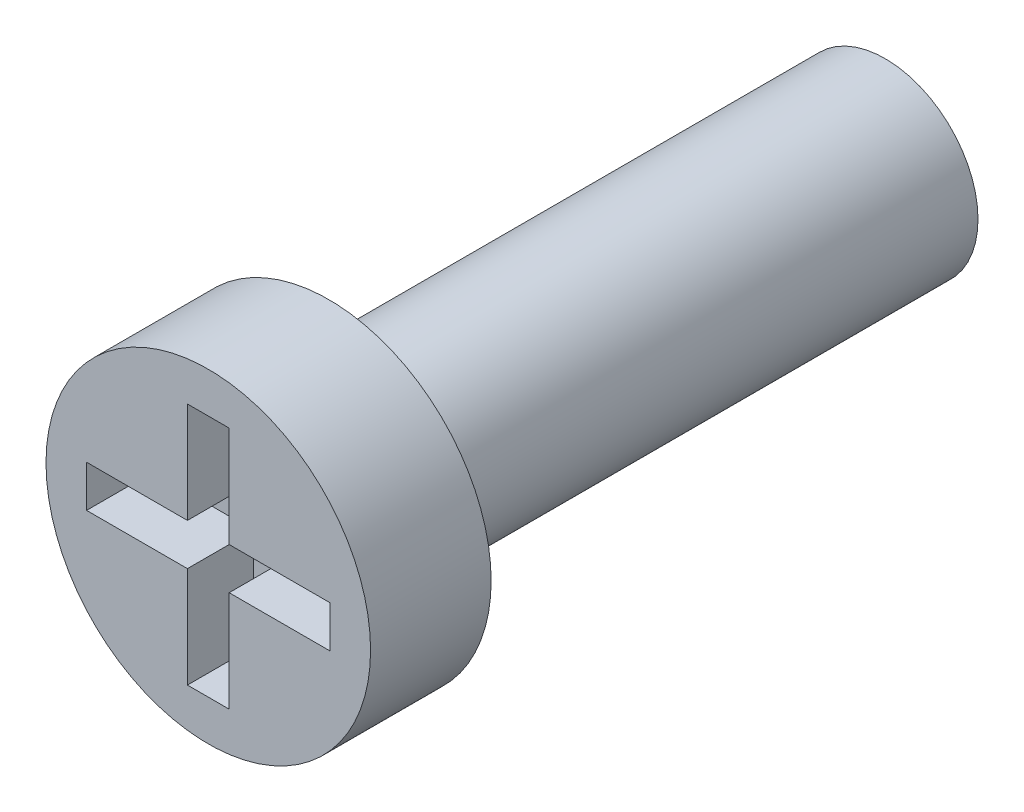
ISO-10303-21;
HEADER;
FILE_DESCRIPTION(('STEP AP214'),'2;1');
FILE_NAME('part.step','',(''),(''),'','','');
FILE_SCHEMA(('AUTOMOTIVE_DESIGN { 1 0 10303 214 1 1 1 1 }'));
ENDSEC;
DATA;
#1=APPLICATION_CONTEXT('core data for automotive mechanical design processes');
#2=APPLICATION_PROTOCOL_DEFINITION('international standard','automotive_design',2000,#1);
#3=PRODUCT_CONTEXT('',#1,'mechanical');
#4=PRODUCT('Part','Part','',(#3));
#5=PRODUCT_RELATED_PRODUCT_CATEGORY('part','',(#4));
#6=PRODUCT_DEFINITION_FORMATION('','',#4);
#7=PRODUCT_DEFINITION_CONTEXT('part definition',#1,'design');
#8=PRODUCT_DEFINITION('design','',#6,#7);
#9=PRODUCT_DEFINITION_SHAPE('','',#8);
#10=(LENGTH_UNIT() NAMED_UNIT(*) SI_UNIT(.MILLI.,.METRE.));
#11=(NAMED_UNIT(*) PLANE_ANGLE_UNIT() SI_UNIT($,.RADIAN.));
#12=(NAMED_UNIT(*) SI_UNIT($,.STERADIAN.) SOLID_ANGLE_UNIT());
#13=UNCERTAINTY_MEASURE_WITH_UNIT(LENGTH_MEASURE(1.E-05),#10,'distance_accuracy_value','');
#14=(GEOMETRIC_REPRESENTATION_CONTEXT(3) GLOBAL_UNCERTAINTY_ASSIGNED_CONTEXT((#13)) GLOBAL_UNIT_ASSIGNED_CONTEXT((#10,
#11,#12)) REPRESENTATION_CONTEXT('',''));
#15=CARTESIAN_POINT('',(0.,0.,0.));
#16=DIRECTION('',(0.,0.,1.));
#17=DIRECTION('',(1.,0.,0.));
#18=AXIS2_PLACEMENT_3D('',#15,#16,#17);
#19=CARTESIAN_POINT('',(0.,-0.225,0.585));
#20=DIRECTION('',(0.,-1.,0.));
#21=DIRECTION('',(0.,0.,-1.));
#22=AXIS2_PLACEMENT_3D('',#19,#20,#21);
#23=PLANE('',#22);
#24=DIRECTION('',(1.,0.,0.));
#25=VECTOR('',#24,1.);
#26=CARTESIAN_POINT('',(0.,-0.225,1.3));
#27=LINE('',#26,#25);
#28=CARTESIAN_POINT('',(-1.3125,-0.225,1.3));
#29=VERTEX_POINT('',#28);
#30=CARTESIAN_POINT('',(-0.225,-0.225,1.3));
#31=VERTEX_POINT('',#30);
#32=EDGE_CURVE('E232',#29,#31,#27,.T.);
#33=ORIENTED_EDGE('',*,*,#32,.T.);
#34=DIRECTION('',(0.,0.,-1.));
#35=VECTOR('',#34,1.);
#36=CARTESIAN_POINT('',(-0.225,-0.225,0.585));
#37=LINE('',#36,#35);
#38=CARTESIAN_POINT('',(-0.225,-0.225,0.585));
#39=VERTEX_POINT('',#38);
#40=EDGE_CURVE('E169',#31,#39,#37,.T.);
#41=ORIENTED_EDGE('',*,*,#40,.T.);
#42=DIRECTION('',(1.,0.,0.));
#43=VECTOR('',#42,1.);
#44=CARTESIAN_POINT('',(0.,-0.225,0.585));
#45=LINE('',#44,#43);
#46=CARTESIAN_POINT('',(-1.3125,-0.225,0.585));
#47=VERTEX_POINT('',#46);
#48=EDGE_CURVE('E174',#47,#39,#45,.T.);
#49=ORIENTED_EDGE('',*,*,#48,.F.);
#50=DIRECTION('',(0.,0.,1.));
#51=VECTOR('',#50,1.);
#52=CARTESIAN_POINT('',(-1.3125,-0.225,0.585));
#53=LINE('',#52,#51);
#54=EDGE_CURVE('E200',#47,#29,#53,.T.);
#55=ORIENTED_EDGE('',*,*,#54,.T.);
#56=EDGE_LOOP('',(#33,#41,#49,#55));
#57=FACE_BOUND('',#56,.T.);
#58=ADVANCED_FACE('F17',(#57),#23,.F.);
#59=CARTESIAN_POINT('',(0.,0.225,0.585));
#60=DIRECTION('',(0.,1.,0.));
#61=DIRECTION('',(0.,0.,1.));
#62=AXIS2_PLACEMENT_3D('',#59,#60,#61);
#63=PLANE('',#62);
#64=DIRECTION('',(-1.,0.,0.));
#65=VECTOR('',#64,1.);
#66=CARTESIAN_POINT('',(0.,0.225,0.585));
#67=LINE('',#66,#65);
#68=CARTESIAN_POINT('',(-0.225,0.225,0.585));
#69=VERTEX_POINT('',#68);
#70=CARTESIAN_POINT('',(-1.3125,0.225,0.585));
#71=VERTEX_POINT('',#70);
#72=EDGE_CURVE('E187',#69,#71,#67,.T.);
#73=ORIENTED_EDGE('',*,*,#72,.F.);
#74=DIRECTION('',(0.,0.,1.));
#75=VECTOR('',#74,1.);
#76=CARTESIAN_POINT('',(-0.225,0.225,0.585));
#77=LINE('',#76,#75);
#78=CARTESIAN_POINT('',(-0.225,0.225,1.3));
#79=VERTEX_POINT('',#78);
#80=EDGE_CURVE('E162',#69,#79,#77,.T.);
#81=ORIENTED_EDGE('',*,*,#80,.T.);
#82=DIRECTION('',(-1.,0.,0.));
#83=VECTOR('',#82,1.);
#84=CARTESIAN_POINT('',(0.,0.225,1.3));
#85=LINE('',#84,#83);
#86=CARTESIAN_POINT('',(-1.3125,0.225,1.3));
#87=VERTEX_POINT('',#86);
#88=EDGE_CURVE('E223',#79,#87,#85,.T.);
#89=ORIENTED_EDGE('',*,*,#88,.T.);
#90=DIRECTION('',(0.,0.,1.));
#91=VECTOR('',#90,1.);
#92=CARTESIAN_POINT('',(-1.3125,0.225,0.585));
#93=LINE('',#92,#91);
#94=EDGE_CURVE('E197',#71,#87,#93,.T.);
#95=ORIENTED_EDGE('',*,*,#94,.F.);
#96=EDGE_LOOP('',(#73,#81,#89,#95));
#97=FACE_BOUND('',#96,.T.);
#98=ADVANCED_FACE('F270',(#97),#63,.F.);
#99=CARTESIAN_POINT('',(0.,0.,-6.));
#100=DIRECTION('',(0.,0.,-1.));
#101=DIRECTION('',(-1.,0.,0.));
#102=AXIS2_PLACEMENT_3D('',#99,#100,#101);
#103=PLANE('',#102);
#104=CARTESIAN_POINT('',(0.,0.,-6.));
#105=DIRECTION('',(0.,0.,1.));
#106=DIRECTION('',(1.,0.,0.));
#107=AXIS2_PLACEMENT_3D('',#104,#105,#106);
#108=CIRCLE('',#107,1.);
#109=CARTESIAN_POINT('',(1.,0.,-6.));
#110=VERTEX_POINT('',#109);
#111=EDGE_CURVE('E216',#110,#110,#108,.T.);
#112=ORIENTED_EDGE('',*,*,#111,.F.);
#113=EDGE_LOOP('',(#112));
#114=FACE_BOUND('',#113,.T.);
#115=ADVANCED_FACE('F280',(#114),#103,.T.);
#116=CARTESIAN_POINT('',(0.,0.,-6.));
#117=DIRECTION('',(0.,0.,1.));
#118=DIRECTION('',(1.,0.,0.));
#119=AXIS2_PLACEMENT_3D('',#116,#117,#118);
#120=CYLINDRICAL_SURFACE('',#119,1.);
#121=CARTESIAN_POINT('',(0.,0.,0.));
#122=DIRECTION('',(0.,0.,-1.));
#123=DIRECTION('',(-1.,0.,0.));
#124=AXIS2_PLACEMENT_3D('',#121,#122,#123);
#125=CIRCLE('',#124,1.);
#126=CARTESIAN_POINT('',(-1.,0.,0.));
#127=VERTEX_POINT('',#126);
#128=EDGE_CURVE('E212',#127,#127,#125,.F.);
#129=ORIENTED_EDGE('',*,*,#128,.F.);
#130=EDGE_LOOP('',(#129));
#131=FACE_BOUND('',#130,.T.);
#132=ORIENTED_EDGE('',*,*,#111,.T.);
#133=EDGE_LOOP('',(#132));
#134=FACE_BOUND('',#133,.T.);
#135=ADVANCED_FACE('F19',(#131,#134),#120,.T.);
#136=CARTESIAN_POINT('',(0.,0.,1.3));
#137=DIRECTION('',(0.,0.,1.));
#138=DIRECTION('',(1.,0.,0.));
#139=AXIS2_PLACEMENT_3D('',#136,#137,#138);
#140=PLANE('',#139);
#141=DIRECTION('',(0.,-1.,0.));
#142=VECTOR('',#141,1.);
#143=CARTESIAN_POINT('',(-0.225,0.,1.3));
#144=LINE('',#143,#142);
#145=CARTESIAN_POINT('',(-0.225,-1.3125,1.3));
#146=VERTEX_POINT('',#145);
#147=EDGE_CURVE('E170',#31,#146,#144,.T.);
#148=ORIENTED_EDGE('',*,*,#147,.F.);
#149=ORIENTED_EDGE('',*,*,#32,.F.);
#150=DIRECTION('',(0.,-1.,0.));
#151=VECTOR('',#150,1.);
#152=CARTESIAN_POINT('',(-1.3125,0.,1.3));
#153=LINE('',#152,#151);
#154=EDGE_CURVE('E228',#87,#29,#153,.T.);
#155=ORIENTED_EDGE('',*,*,#154,.F.);
#156=ORIENTED_EDGE('',*,*,#88,.F.);
#157=CARTESIAN_POINT('',(-0.225,1.3125,1.3));
#158=VERTEX_POINT('',#157);
#159=EDGE_CURVE('E166',#158,#79,#144,.T.);
#160=ORIENTED_EDGE('',*,*,#159,.F.);
#161=DIRECTION('',(-1.,0.,0.));
#162=VECTOR('',#161,1.);
#163=CARTESIAN_POINT('',(0.,1.3125,1.3));
#164=LINE('',#163,#162);
#165=CARTESIAN_POINT('',(0.225,1.3125,1.3));
#166=VERTEX_POINT('',#165);
#167=EDGE_CURVE('E26',#166,#158,#164,.T.);
#168=ORIENTED_EDGE('',*,*,#167,.F.);
#169=DIRECTION('',(0.,1.,0.));
#170=VECTOR('',#169,1.);
#171=CARTESIAN_POINT('',(0.225,0.,1.3));
#172=LINE('',#171,#170);
#173=CARTESIAN_POINT('',(0.225,0.225,1.3));
#174=VERTEX_POINT('',#173);
#175=EDGE_CURVE('E157',#174,#166,#172,.T.);
#176=ORIENTED_EDGE('',*,*,#175,.F.);
#177=CARTESIAN_POINT('',(1.3125,0.225,1.3));
#178=VERTEX_POINT('',#177);
#179=EDGE_CURVE('E224',#178,#174,#85,.T.);
#180=ORIENTED_EDGE('',*,*,#179,.F.);
#181=DIRECTION('',(0.,1.,0.));
#182=VECTOR('',#181,1.);
#183=CARTESIAN_POINT('',(1.3125,0.,1.3));
#184=LINE('',#183,#182);
#185=CARTESIAN_POINT('',(1.3125,-0.225,1.3));
#186=VERTEX_POINT('',#185);
#187=EDGE_CURVE('E220',#186,#178,#184,.T.);
#188=ORIENTED_EDGE('',*,*,#187,.F.);
#189=CARTESIAN_POINT('',(0.225,-0.225,1.3));
#190=VERTEX_POINT('',#189);
#191=EDGE_CURVE('E231',#190,#186,#27,.T.);
#192=ORIENTED_EDGE('',*,*,#191,.F.);
#193=CARTESIAN_POINT('',(0.225,-1.3125,1.3));
#194=VERTEX_POINT('',#193);
#195=EDGE_CURVE('E33',#194,#190,#172,.T.);
#196=ORIENTED_EDGE('',*,*,#195,.F.);
#197=DIRECTION('',(1.,0.,0.));
#198=VECTOR('',#197,1.);
#199=CARTESIAN_POINT('',(0.,-1.3125,1.3));
#200=LINE('',#199,#198);
#201=EDGE_CURVE('E11',#146,#194,#200,.T.);
#202=ORIENTED_EDGE('',*,*,#201,.F.);
#203=EDGE_LOOP('',(#148,#149,#155,#156,#160,#168,#176,#180,#188,#192,#196,#202));
#204=FACE_BOUND('',#203,.T.);
#205=CARTESIAN_POINT('',(0.,0.,1.3));
#206=DIRECTION('',(0.,0.,-1.));
#207=DIRECTION('',(-1.,0.,0.));
#208=AXIS2_PLACEMENT_3D('',#205,#206,#207);
#209=CIRCLE('',#208,1.75);
#210=CARTESIAN_POINT('',(-1.75,0.,1.3));
#211=VERTEX_POINT('',#210);
#212=EDGE_CURVE('E208',#211,#211,#209,.T.);
#213=ORIENTED_EDGE('',*,*,#212,.F.);
#214=EDGE_LOOP('',(#213));
#215=FACE_BOUND('',#214,.T.);
#216=ADVANCED_FACE('F248',(#204,#215),#140,.T.);
#217=CARTESIAN_POINT('',(0.,0.,0.));
#218=DIRECTION('',(0.,0.,-1.));
#219=DIRECTION('',(-1.,0.,0.));
#220=AXIS2_PLACEMENT_3D('',#217,#218,#219);
#221=PLANE('',#220);
#222=ORIENTED_EDGE('',*,*,#128,.T.);
#223=EDGE_LOOP('',(#222));
#224=FACE_BOUND('',#223,.T.);
#225=CARTESIAN_POINT('',(0.,0.,0.));
#226=DIRECTION('',(0.,0.,1.));
#227=DIRECTION('',(1.,0.,0.));
#228=AXIS2_PLACEMENT_3D('',#225,#226,#227);
#229=CIRCLE('',#228,1.75);
#230=CARTESIAN_POINT('',(1.75,0.,0.));
#231=VERTEX_POINT('',#230);
#232=EDGE_CURVE('E204',#231,#231,#229,.T.);
#233=ORIENTED_EDGE('',*,*,#232,.F.);
#234=EDGE_LOOP('',(#233));
#235=FACE_BOUND('',#234,.T.);
#236=ADVANCED_FACE('F291',(#224,#235),#221,.T.);
#237=CARTESIAN_POINT('',(0.,0.,0.));
#238=DIRECTION('',(0.,0.,1.));
#239=DIRECTION('',(1.,0.,0.));
#240=AXIS2_PLACEMENT_3D('',#237,#238,#239);
#241=CYLINDRICAL_SURFACE('',#240,1.75);
#242=ORIENTED_EDGE('',*,*,#212,.T.);
#243=EDGE_LOOP('',(#242));
#244=FACE_BOUND('',#243,.T.);
#245=ORIENTED_EDGE('',*,*,#232,.T.);
#246=EDGE_LOOP('',(#245));
#247=FACE_BOUND('',#246,.T.);
#248=ADVANCED_FACE('F286',(#244,#247),#241,.T.);
#249=CARTESIAN_POINT('',(0.225,-0.225,0.585));
#250=VERTEX_POINT('',#249);
#251=CARTESIAN_POINT('',(1.3125,-0.225,0.585));
#252=VERTEX_POINT('',#251);
#253=EDGE_CURVE('E178',#250,#252,#45,.T.);
#254=ORIENTED_EDGE('',*,*,#253,.F.);
#255=DIRECTION('',(0.,0.,1.));
#256=VECTOR('',#255,1.);
#257=CARTESIAN_POINT('',(0.225,-0.225,0.585));
#258=LINE('',#257,#256);
#259=EDGE_CURVE('E128',#250,#190,#258,.T.);
#260=ORIENTED_EDGE('',*,*,#259,.T.);
#261=ORIENTED_EDGE('',*,*,#191,.T.);
#262=DIRECTION('',(0.,0.,1.));
#263=VECTOR('',#262,1.);
#264=CARTESIAN_POINT('',(1.3125,-0.225,0.585));
#265=LINE('',#264,#263);
#266=EDGE_CURVE('E183',#252,#186,#265,.T.);
#267=ORIENTED_EDGE('',*,*,#266,.F.);
#268=EDGE_LOOP('',(#254,#260,#261,#267));
#269=FACE_BOUND('',#268,.T.);
#270=ADVANCED_FACE('F276',(#269),#23,.F.);
#271=CARTESIAN_POINT('',(-1.3125,0.,0.585));
#272=DIRECTION('',(-1.,0.,0.));
#273=DIRECTION('',(0.,0.,1.));
#274=AXIS2_PLACEMENT_3D('',#271,#272,#273);
#275=PLANE('',#274);
#276=ORIENTED_EDGE('',*,*,#154,.T.);
#277=ORIENTED_EDGE('',*,*,#54,.F.);
#278=DIRECTION('',(0.,-1.,0.));
#279=VECTOR('',#278,1.);
#280=CARTESIAN_POINT('',(-1.3125,0.,0.585));
#281=LINE('',#280,#279);
#282=EDGE_CURVE('E177',#71,#47,#281,.T.);
#283=ORIENTED_EDGE('',*,*,#282,.F.);
#284=ORIENTED_EDGE('',*,*,#94,.T.);
#285=EDGE_LOOP('',(#276,#277,#283,#284));
#286=FACE_BOUND('',#285,.T.);
#287=ADVANCED_FACE('F272',(#286),#275,.F.);
#288=ORIENTED_EDGE('',*,*,#179,.T.);
#289=DIRECTION('',(0.,0.,-1.));
#290=VECTOR('',#289,1.);
#291=CARTESIAN_POINT('',(0.225,0.225,0.585));
#292=LINE('',#291,#290);
#293=CARTESIAN_POINT('',(0.225,0.225,0.585));
#294=VERTEX_POINT('',#293);
#295=EDGE_CURVE('E154',#174,#294,#292,.T.);
#296=ORIENTED_EDGE('',*,*,#295,.T.);
#297=CARTESIAN_POINT('',(1.3125,0.225,0.585));
#298=VERTEX_POINT('',#297);
#299=EDGE_CURVE('E184',#298,#294,#67,.T.);
#300=ORIENTED_EDGE('',*,*,#299,.F.);
#301=DIRECTION('',(0.,0.,1.));
#302=VECTOR('',#301,1.);
#303=CARTESIAN_POINT('',(1.3125,0.225,0.585));
#304=LINE('',#303,#302);
#305=EDGE_CURVE('E194',#298,#178,#304,.T.);
#306=ORIENTED_EDGE('',*,*,#305,.T.);
#307=EDGE_LOOP('',(#288,#296,#300,#306));
#308=FACE_BOUND('',#307,.T.);
#309=ADVANCED_FACE('F282',(#308),#63,.F.);
#310=CARTESIAN_POINT('',(0.,0.,0.585));
#311=DIRECTION('',(0.,0.,-1.));
#312=DIRECTION('',(-1.,0.,0.));
#313=AXIS2_PLACEMENT_3D('',#310,#311,#312);
#314=PLANE('',#313);
#315=ORIENTED_EDGE('',*,*,#299,.T.);
#316=DIRECTION('',(0.,1.,0.));
#317=VECTOR('',#316,1.);
#318=CARTESIAN_POINT('',(0.225,0.,0.585));
#319=LINE('',#318,#317);
#320=CARTESIAN_POINT('',(0.225,1.3125,0.585));
#321=VERTEX_POINT('',#320);
#322=EDGE_CURVE('E41',#294,#321,#319,.T.);
#323=ORIENTED_EDGE('',*,*,#322,.T.);
#324=DIRECTION('',(-1.,0.,0.));
#325=VECTOR('',#324,1.);
#326=CARTESIAN_POINT('',(0.,1.3125,0.585));
#327=LINE('',#326,#325);
#328=CARTESIAN_POINT('',(-0.225,1.3125,0.585));
#329=VERTEX_POINT('',#328);
#330=EDGE_CURVE('E135',#321,#329,#327,.T.);
#331=ORIENTED_EDGE('',*,*,#330,.T.);
#332=DIRECTION('',(0.,-1.,0.));
#333=VECTOR('',#332,1.);
#334=CARTESIAN_POINT('',(-0.225,0.,0.585));
#335=LINE('',#334,#333);
#336=EDGE_CURVE('E140',#329,#69,#335,.T.);
#337=ORIENTED_EDGE('',*,*,#336,.T.);
#338=ORIENTED_EDGE('',*,*,#72,.T.);
#339=ORIENTED_EDGE('',*,*,#282,.T.);
#340=ORIENTED_EDGE('',*,*,#48,.T.);
#341=CARTESIAN_POINT('',(-0.225,-1.3125,0.585));
#342=VERTEX_POINT('',#341);
#343=EDGE_CURVE('E123',#39,#342,#335,.T.);
#344=ORIENTED_EDGE('',*,*,#343,.T.);
#345=DIRECTION('',(1.,0.,0.));
#346=VECTOR('',#345,1.);
#347=CARTESIAN_POINT('',(0.,-1.3125,0.585));
#348=LINE('',#347,#346);
#349=CARTESIAN_POINT('',(0.225,-1.3125,0.585));
#350=VERTEX_POINT('',#349);
#351=EDGE_CURVE('E110',#342,#350,#348,.T.);
#352=ORIENTED_EDGE('',*,*,#351,.T.);
#353=EDGE_CURVE('E115',#350,#250,#319,.T.);
#354=ORIENTED_EDGE('',*,*,#353,.T.);
#355=ORIENTED_EDGE('',*,*,#253,.T.);
#356=DIRECTION('',(0.,1.,0.));
#357=VECTOR('',#356,1.);
#358=CARTESIAN_POINT('',(1.3125,0.,0.585));
#359=LINE('',#358,#357);
#360=EDGE_CURVE('E179',#252,#298,#359,.T.);
#361=ORIENTED_EDGE('',*,*,#360,.T.);
#362=EDGE_LOOP('',(#315,#323,#331,#337,#338,#339,#340,#344,#352,#354,#355,#361));
#363=FACE_BOUND('',#362,.T.);
#364=ADVANCED_FACE('F120',(#363),#314,.F.);
#365=CARTESIAN_POINT('',(1.3125,0.,0.585));
#366=DIRECTION('',(1.,0.,0.));
#367=DIRECTION('',(0.,0.,-1.));
#368=AXIS2_PLACEMENT_3D('',#365,#366,#367);
#369=PLANE('',#368);
#370=ORIENTED_EDGE('',*,*,#187,.T.);
#371=ORIENTED_EDGE('',*,*,#305,.F.);
#372=ORIENTED_EDGE('',*,*,#360,.F.);
#373=ORIENTED_EDGE('',*,*,#266,.T.);
#374=EDGE_LOOP('',(#370,#371,#372,#373));
#375=FACE_BOUND('',#374,.T.);
#376=ADVANCED_FACE('F296',(#375),#369,.F.);
#377=CARTESIAN_POINT('',(0.225,0.,0.585));
#378=DIRECTION('',(1.,0.,0.));
#379=DIRECTION('',(0.,0.,-1.));
#380=AXIS2_PLACEMENT_3D('',#377,#378,#379);
#381=PLANE('',#380);
#382=ORIENTED_EDGE('',*,*,#175,.T.);
#383=DIRECTION('',(0.,0.,1.));
#384=VECTOR('',#383,1.);
#385=CARTESIAN_POINT('',(0.225,1.3125,0.585));
#386=LINE('',#385,#384);
#387=EDGE_CURVE('E114',#321,#166,#386,.T.);
#388=ORIENTED_EDGE('',*,*,#387,.F.);
#389=ORIENTED_EDGE('',*,*,#322,.F.);
#390=ORIENTED_EDGE('',*,*,#295,.F.);
#391=EDGE_LOOP('',(#382,#388,#389,#390));
#392=FACE_BOUND('',#391,.T.);
#393=ADVANCED_FACE('F300',(#392),#381,.F.);
#394=CARTESIAN_POINT('',(-0.225,0.,0.585));
#395=DIRECTION('',(-1.,0.,0.));
#396=DIRECTION('',(0.,0.,1.));
#397=AXIS2_PLACEMENT_3D('',#394,#395,#396);
#398=PLANE('',#397);
#399=ORIENTED_EDGE('',*,*,#159,.T.);
#400=ORIENTED_EDGE('',*,*,#80,.F.);
#401=ORIENTED_EDGE('',*,*,#336,.F.);
#402=DIRECTION('',(0.,0.,1.));
#403=VECTOR('',#402,1.);
#404=CARTESIAN_POINT('',(-0.225,1.3125,0.585));
#405=LINE('',#404,#403);
#406=EDGE_CURVE('E147',#329,#158,#405,.T.);
#407=ORIENTED_EDGE('',*,*,#406,.T.);
#408=EDGE_LOOP('',(#399,#400,#401,#407));
#409=FACE_BOUND('',#408,.T.);
#410=ADVANCED_FACE('F245',(#409),#398,.F.);
#411=CARTESIAN_POINT('',(0.,1.3125,0.585));
#412=DIRECTION('',(0.,1.,0.));
#413=DIRECTION('',(0.,0.,1.));
#414=AXIS2_PLACEMENT_3D('',#411,#412,#413);
#415=PLANE('',#414);
#416=ORIENTED_EDGE('',*,*,#167,.T.);
#417=ORIENTED_EDGE('',*,*,#406,.F.);
#418=ORIENTED_EDGE('',*,*,#330,.F.);
#419=ORIENTED_EDGE('',*,*,#387,.T.);
#420=EDGE_LOOP('',(#416,#417,#418,#419));
#421=FACE_BOUND('',#420,.T.);
#422=ADVANCED_FACE('F238',(#421),#415,.F.);
#423=ORIENTED_EDGE('',*,*,#147,.T.);
#424=DIRECTION('',(0.,0.,1.));
#425=VECTOR('',#424,1.);
#426=CARTESIAN_POINT('',(-0.225,-1.3125,0.585));
#427=LINE('',#426,#425);
#428=EDGE_CURVE('E151',#342,#146,#427,.T.);
#429=ORIENTED_EDGE('',*,*,#428,.F.);
#430=ORIENTED_EDGE('',*,*,#343,.F.);
#431=ORIENTED_EDGE('',*,*,#40,.F.);
#432=EDGE_LOOP('',(#423,#429,#430,#431));
#433=FACE_BOUND('',#432,.T.);
#434=ADVANCED_FACE('F262',(#433),#398,.F.);
#435=ORIENTED_EDGE('',*,*,#195,.T.);
#436=ORIENTED_EDGE('',*,*,#259,.F.);
#437=ORIENTED_EDGE('',*,*,#353,.F.);
#438=DIRECTION('',(0.,0.,1.));
#439=VECTOR('',#438,1.);
#440=CARTESIAN_POINT('',(0.225,-1.3125,0.585));
#441=LINE('',#440,#439);
#442=EDGE_CURVE('E106',#350,#194,#441,.T.);
#443=ORIENTED_EDGE('',*,*,#442,.T.);
#444=EDGE_LOOP('',(#435,#436,#437,#443));
#445=FACE_BOUND('',#444,.T.);
#446=ADVANCED_FACE('F127',(#445),#381,.F.);
#447=CARTESIAN_POINT('',(0.,-1.3125,0.585));
#448=DIRECTION('',(0.,-1.,0.));
#449=DIRECTION('',(0.,0.,-1.));
#450=AXIS2_PLACEMENT_3D('',#447,#448,#449);
#451=PLANE('',#450);
#452=ORIENTED_EDGE('',*,*,#201,.T.);
#453=ORIENTED_EDGE('',*,*,#442,.F.);
#454=ORIENTED_EDGE('',*,*,#351,.F.);
#455=ORIENTED_EDGE('',*,*,#428,.T.);
#456=EDGE_LOOP('',(#452,#453,#454,#455));
#457=FACE_BOUND('',#456,.T.);
#458=ADVANCED_FACE('F108',(#457),#451,.F.);
#459=CLOSED_SHELL('',(#58,#98,#115,#135,#216,#236,#248,#270,#287,#309,#364,#376,#393,#410,#422,
#434,#446,#458));
#460=MANIFOLD_SOLID_BREP('B1',#459);
#461=ADVANCED_BREP_SHAPE_REPRESENTATION('',(#18,#460),#14);
#462=SHAPE_DEFINITION_REPRESENTATION(#9,#461);
ENDSEC;
END-ISO-10303-21;
